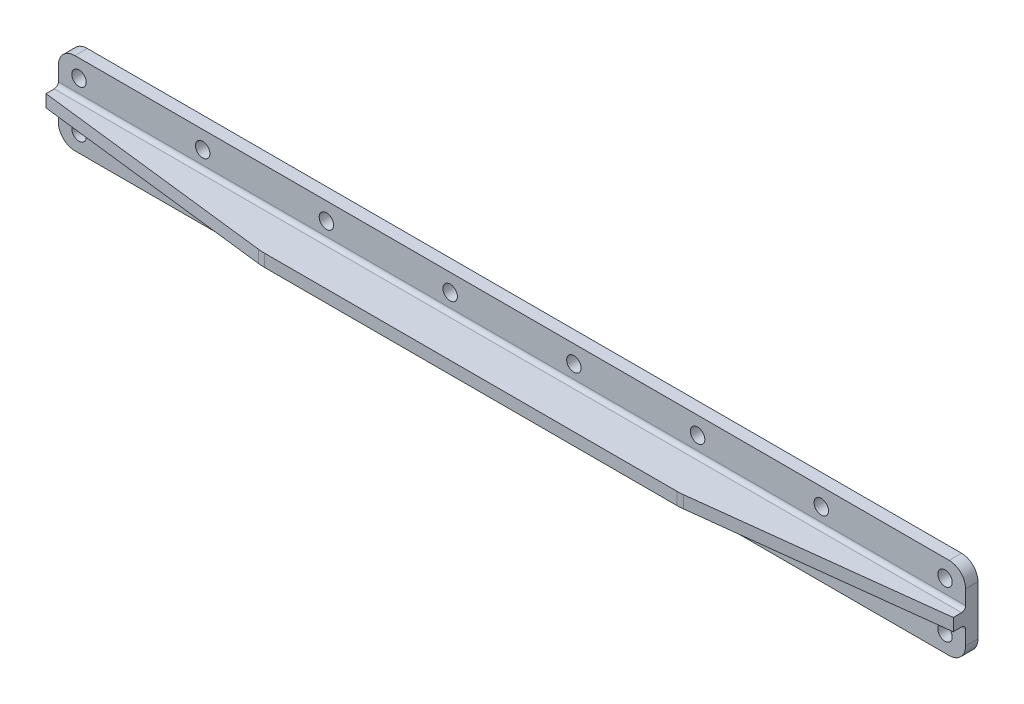
ISO-10303-21;
HEADER;
FILE_DESCRIPTION(('STEP AP214'),'2;1');
FILE_NAME('part.step','',(''),(''),'','','');
FILE_SCHEMA(('AUTOMOTIVE_DESIGN { 1 0 10303 214 1 1 1 1 }'));
ENDSEC;
DATA;
#1=APPLICATION_CONTEXT('core data for automotive mechanical design processes');
#2=APPLICATION_PROTOCOL_DEFINITION('international standard','automotive_design',2000,#1);
#3=PRODUCT_CONTEXT('',#1,'mechanical');
#4=PRODUCT('Part','Part','',(#3));
#5=PRODUCT_RELATED_PRODUCT_CATEGORY('part','',(#4));
#6=PRODUCT_DEFINITION_FORMATION('','',#4);
#7=PRODUCT_DEFINITION_CONTEXT('part definition',#1,'design');
#8=PRODUCT_DEFINITION('design','',#6,#7);
#9=PRODUCT_DEFINITION_SHAPE('','',#8);
#10=(LENGTH_UNIT() NAMED_UNIT(*) SI_UNIT(.MILLI.,.METRE.));
#11=(NAMED_UNIT(*) PLANE_ANGLE_UNIT() SI_UNIT($,.RADIAN.));
#12=(NAMED_UNIT(*) SI_UNIT($,.STERADIAN.) SOLID_ANGLE_UNIT());
#13=UNCERTAINTY_MEASURE_WITH_UNIT(LENGTH_MEASURE(1.E-05),#10,'distance_accuracy_value','');
#14=(GEOMETRIC_REPRESENTATION_CONTEXT(3) GLOBAL_UNCERTAINTY_ASSIGNED_CONTEXT((#13)) GLOBAL_UNIT_ASSIGNED_CONTEXT((#10,
#11,#12)) REPRESENTATION_CONTEXT('',''));
#15=CARTESIAN_POINT('',(0.,0.,0.));
#16=DIRECTION('',(0.,0.,1.));
#17=DIRECTION('',(1.,0.,0.));
#18=AXIS2_PLACEMENT_3D('',#15,#16,#17);
#19=CARTESIAN_POINT('',(110.,-1.5,13.));
#20=DIRECTION('',(0.,0.,-1.));
#21=DIRECTION('',(-1.,0.,0.));
#22=AXIS2_PLACEMENT_3D('',#19,#20,#21);
#23=PLANE('',#22);
#24=DIRECTION('',(0.,1.,0.));
#25=VECTOR('',#24,1.);
#26=CARTESIAN_POINT('',(50.,-10.,13.));
#27=LINE('',#26,#25);
#28=CARTESIAN_POINT('',(50.,-1.5,13.));
#29=VERTEX_POINT('',#28);
#30=CARTESIAN_POINT('',(50.,1.5,13.));
#31=VERTEX_POINT('',#30);
#32=EDGE_CURVE('E191',#29,#31,#27,.T.);
#33=ORIENTED_EDGE('',*,*,#32,.T.);
#34=DIRECTION('',(-1.,0.,0.));
#35=VECTOR('',#34,1.);
#36=CARTESIAN_POINT('',(110.,1.5,13.));
#37=LINE('',#36,#35);
#38=CARTESIAN_POINT('',(-50.,1.5,13.));
#39=VERTEX_POINT('',#38);
#40=EDGE_CURVE('E341',#31,#39,#37,.T.);
#41=ORIENTED_EDGE('',*,*,#40,.T.);
#42=DIRECTION('',(0.,1.,0.));
#43=VECTOR('',#42,1.);
#44=CARTESIAN_POINT('',(-50.,-10.,13.));
#45=LINE('',#44,#43);
#46=CARTESIAN_POINT('',(-50.,-1.5,13.));
#47=VERTEX_POINT('',#46);
#48=EDGE_CURVE('E205',#47,#39,#45,.T.);
#49=ORIENTED_EDGE('',*,*,#48,.F.);
#50=DIRECTION('',(-1.,0.,0.));
#51=VECTOR('',#50,1.);
#52=CARTESIAN_POINT('',(110.,-1.5,13.));
#53=LINE('',#52,#51);
#54=EDGE_CURVE('E339',#29,#47,#53,.T.);
#55=ORIENTED_EDGE('',*,*,#54,.F.);
#56=EDGE_LOOP('',(#33,#41,#49,#55));
#57=FACE_BOUND('',#56,.T.);
#58=ADVANCED_FACE('F33',(#57),#23,.F.);
#59=CARTESIAN_POINT('',(110.,1.5,13.));
#60=DIRECTION('',(0.,-1.,0.));
#61=DIRECTION('',(0.,0.,-1.));
#62=AXIS2_PLACEMENT_3D('',#59,#60,#61);
#63=PLANE('',#62);
#64=DIRECTION('',(0.,0.,1.));
#65=VECTOR('',#64,1.);
#66=CARTESIAN_POINT('',(110.,1.5,13.));
#67=LINE('',#66,#65);
#68=CARTESIAN_POINT('',(110.,1.5,4.));
#69=VERTEX_POINT('',#68);
#70=CARTESIAN_POINT('',(110.,1.5,6.));
#71=VERTEX_POINT('',#70);
#72=EDGE_CURVE('E158',#69,#71,#67,.T.);
#73=ORIENTED_EDGE('',*,*,#72,.F.);
#74=DIRECTION('',(-1.,0.,0.));
#75=VECTOR('',#74,1.);
#76=CARTESIAN_POINT('',(-110.,1.5,4.));
#77=LINE('',#76,#75);
#78=CARTESIAN_POINT('',(-110.,1.5,4.));
#79=VERTEX_POINT('',#78);
#80=EDGE_CURVE('E389',#69,#79,#77,.T.);
#81=ORIENTED_EDGE('',*,*,#80,.T.);
#82=DIRECTION('',(0.,0.,1.));
#83=VECTOR('',#82,1.);
#84=CARTESIAN_POINT('',(-110.,1.5,13.));
#85=LINE('',#84,#83);
#86=CARTESIAN_POINT('',(-110.,1.5,6.));
#87=VERTEX_POINT('',#86);
#88=EDGE_CURVE('E319',#79,#87,#85,.T.);
#89=ORIENTED_EDGE('',*,*,#88,.T.);
#90=DIRECTION('',(-0.993089709571982,0.,-0.117357695709469));
#91=VECTOR('',#90,1.);
#92=CARTESIAN_POINT('',(-51.5256500442231,1.5,12.9101662244358));
#93=LINE('',#92,#91);
#94=CARTESIAN_POINT('',(-51.5256500442231,1.5,12.9101662244358));
#95=VERTEX_POINT('',#94);
#96=EDGE_CURVE('E202',#95,#87,#93,.T.);
#97=ORIENTED_EDGE('',*,*,#96,.F.);
#98=CARTESIAN_POINT('',(-50.,1.5,0.));
#99=DIRECTION('',(0.,-1.,0.));
#100=DIRECTION('',(0.,0.,1.));
#101=AXIS2_PLACEMENT_3D('',#98,#99,#100);
#102=CIRCLE('',#101,13.);
#103=EDGE_CURVE('E199',#39,#95,#102,.T.);
#104=ORIENTED_EDGE('',*,*,#103,.F.);
#105=ORIENTED_EDGE('',*,*,#40,.F.);
#106=CARTESIAN_POINT('',(50.,1.5,0.));
#107=DIRECTION('',(0.,-1.,0.));
#108=DIRECTION('',(0.,0.,1.));
#109=AXIS2_PLACEMENT_3D('',#106,#107,#108);
#110=CIRCLE('',#109,13.);
#111=CARTESIAN_POINT('',(51.5256500442231,1.5,12.9101662244358));
#112=VERTEX_POINT('',#111);
#113=EDGE_CURVE('E186',#112,#31,#110,.T.);
#114=ORIENTED_EDGE('',*,*,#113,.F.);
#115=DIRECTION('',(-0.993089709571982,0.,0.117357695709469));
#116=VECTOR('',#115,1.);
#117=CARTESIAN_POINT('',(51.5256500442231,1.5,12.9101662244358));
#118=LINE('',#117,#116);
#119=EDGE_CURVE('E177',#71,#112,#118,.T.);
#120=ORIENTED_EDGE('',*,*,#119,.F.);
#121=EDGE_LOOP('',(#73,#81,#89,#97,#104,#105,#114,#120));
#122=FACE_BOUND('',#121,.T.);
#123=ADVANCED_FACE('F184',(#122),#63,.F.);
#124=CARTESIAN_POINT('',(110.,-1.5,13.));
#125=DIRECTION('',(0.,1.,0.));
#126=DIRECTION('',(0.,0.,1.));
#127=AXIS2_PLACEMENT_3D('',#124,#125,#126);
#128=PLANE('',#127);
#129=DIRECTION('',(0.,0.,-1.));
#130=VECTOR('',#129,1.);
#131=CARTESIAN_POINT('',(-110.,-1.5,13.));
#132=LINE('',#131,#130);
#133=CARTESIAN_POINT('',(-110.,-1.5,6.));
#134=VERTEX_POINT('',#133);
#135=CARTESIAN_POINT('',(-110.,-1.5,4.));
#136=VERTEX_POINT('',#135);
#137=EDGE_CURVE('E321',#134,#136,#132,.T.);
#138=ORIENTED_EDGE('',*,*,#137,.T.);
#139=DIRECTION('',(-1.,0.,0.));
#140=VECTOR('',#139,1.);
#141=CARTESIAN_POINT('',(110.,-1.5,4.));
#142=LINE('',#141,#140);
#143=CARTESIAN_POINT('',(110.,-1.5,4.));
#144=VERTEX_POINT('',#143);
#145=EDGE_CURVE('E387',#136,#144,#142,.F.);
#146=ORIENTED_EDGE('',*,*,#145,.T.);
#147=DIRECTION('',(0.,0.,-1.));
#148=VECTOR('',#147,1.);
#149=CARTESIAN_POINT('',(110.,-1.5,13.));
#150=LINE('',#149,#148);
#151=CARTESIAN_POINT('',(110.,-1.5,6.));
#152=VERTEX_POINT('',#151);
#153=EDGE_CURVE('E170',#152,#144,#150,.T.);
#154=ORIENTED_EDGE('',*,*,#153,.F.);
#155=DIRECTION('',(-0.993089709571982,0.,0.117357695709469));
#156=VECTOR('',#155,1.);
#157=CARTESIAN_POINT('',(109.184172960363,-1.5,6.09640980119566));
#158=LINE('',#157,#156);
#159=CARTESIAN_POINT('',(51.5256500442231,-1.5,12.9101662244358));
#160=VERTEX_POINT('',#159);
#161=EDGE_CURVE('E180',#152,#160,#158,.T.);
#162=ORIENTED_EDGE('',*,*,#161,.T.);
#163=CARTESIAN_POINT('',(50.,-1.5,0.));
#164=DIRECTION('',(0.,1.,0.));
#165=DIRECTION('',(0.,0.,1.));
#166=AXIS2_PLACEMENT_3D('',#163,#164,#165);
#167=CIRCLE('',#166,13.);
#168=EDGE_CURVE('E196',#160,#29,#167,.F.);
#169=ORIENTED_EDGE('',*,*,#168,.T.);
#170=ORIENTED_EDGE('',*,*,#54,.T.);
#171=CARTESIAN_POINT('',(-50.,-1.5,0.));
#172=DIRECTION('',(0.,1.,0.));
#173=DIRECTION('',(0.,0.,1.));
#174=AXIS2_PLACEMENT_3D('',#171,#172,#173);
#175=CIRCLE('',#174,13.);
#176=CARTESIAN_POINT('',(-51.5256500442231,-1.5,12.9101662244358));
#177=VERTEX_POINT('',#176);
#178=EDGE_CURVE('E182',#47,#177,#175,.F.);
#179=ORIENTED_EDGE('',*,*,#178,.T.);
#180=DIRECTION('',(-0.993089709571982,0.,-0.117357695709469));
#181=VECTOR('',#180,1.);
#182=CARTESIAN_POINT('',(107.785804716345,-1.5,31.7366881897894));
#183=LINE('',#182,#181);
#184=EDGE_CURVE('E208',#177,#134,#183,.T.);
#185=ORIENTED_EDGE('',*,*,#184,.T.);
#186=EDGE_LOOP('',(#138,#146,#154,#162,#169,#170,#179,#185));
#187=FACE_BOUND('',#186,.T.);
#188=ADVANCED_FACE('F412',(#187),#128,.F.);
#189=CARTESIAN_POINT('',(110.,1.5,3.));
#190=DIRECTION('',(0.,0.,-1.));
#191=DIRECTION('',(0.,1.,0.));
#192=AXIS2_PLACEMENT_3D('',#189,#190,#191);
#193=PLANE('',#192);
#194=CARTESIAN_POINT('',(15.,5.74999999999999,3.));
#195=DIRECTION('',(0.,0.,1.));
#196=DIRECTION('',(1.,0.,0.));
#197=AXIS2_PLACEMENT_3D('',#194,#195,#196);
#198=CIRCLE('',#197,1.75);
#199=CARTESIAN_POINT('',(16.75,5.74999999999999,3.));
#200=VERTEX_POINT('',#199);
#201=EDGE_CURVE('E260',#200,#200,#198,.T.);
#202=ORIENTED_EDGE('',*,*,#201,.F.);
#203=EDGE_LOOP('',(#202));
#204=FACE_BOUND('',#203,.T.);
#205=CARTESIAN_POINT('',(45.,5.74999999999999,3.));
#206=DIRECTION('',(0.,0.,1.));
#207=DIRECTION('',(1.,0.,0.));
#208=AXIS2_PLACEMENT_3D('',#205,#206,#207);
#209=CIRCLE('',#208,1.75);
#210=CARTESIAN_POINT('',(46.75,5.74999999999999,3.));
#211=VERTEX_POINT('',#210);
#212=EDGE_CURVE('E266',#211,#211,#209,.T.);
#213=ORIENTED_EDGE('',*,*,#212,.F.);
#214=EDGE_LOOP('',(#213));
#215=FACE_BOUND('',#214,.T.);
#216=CARTESIAN_POINT('',(75.,5.74999999999999,3.));
#217=DIRECTION('',(0.,0.,1.));
#218=DIRECTION('',(1.,0.,0.));
#219=AXIS2_PLACEMENT_3D('',#216,#217,#218);
#220=CIRCLE('',#219,1.75);
#221=CARTESIAN_POINT('',(76.75,5.74999999999999,3.));
#222=VERTEX_POINT('',#221);
#223=EDGE_CURVE('E272',#222,#222,#220,.T.);
#224=ORIENTED_EDGE('',*,*,#223,.F.);
#225=EDGE_LOOP('',(#224));
#226=FACE_BOUND('',#225,.T.);
#227=CARTESIAN_POINT('',(105.,5.75,3.));
#228=DIRECTION('',(0.,0.,1.));
#229=DIRECTION('',(1.,0.,0.));
#230=AXIS2_PLACEMENT_3D('',#227,#228,#229);
#231=CIRCLE('',#230,1.75);
#232=CARTESIAN_POINT('',(106.75,5.75,3.));
#233=VERTEX_POINT('',#232);
#234=EDGE_CURVE('E278',#233,#233,#231,.T.);
#235=ORIENTED_EDGE('',*,*,#234,.F.);
#236=EDGE_LOOP('',(#235));
#237=FACE_BOUND('',#236,.T.);
#238=CARTESIAN_POINT('',(-105.,5.75,3.));
#239=DIRECTION('',(0.,0.,1.));
#240=DIRECTION('',(-1.,0.,0.));
#241=AXIS2_PLACEMENT_3D('',#238,#239,#240);
#242=CIRCLE('',#241,1.75);
#243=CARTESIAN_POINT('',(-106.75,5.75,3.));
#244=VERTEX_POINT('',#243);
#245=EDGE_CURVE('E284',#244,#244,#242,.T.);
#246=ORIENTED_EDGE('',*,*,#245,.F.);
#247=EDGE_LOOP('',(#246));
#248=FACE_BOUND('',#247,.T.);
#249=CARTESIAN_POINT('',(-75.,5.74999999999999,3.));
#250=DIRECTION('',(0.,0.,1.));
#251=DIRECTION('',(-1.,0.,0.));
#252=AXIS2_PLACEMENT_3D('',#249,#250,#251);
#253=CIRCLE('',#252,1.75);
#254=CARTESIAN_POINT('',(-76.75,5.74999999999999,3.));
#255=VERTEX_POINT('',#254);
#256=EDGE_CURVE('E290',#255,#255,#253,.T.);
#257=ORIENTED_EDGE('',*,*,#256,.F.);
#258=EDGE_LOOP('',(#257));
#259=FACE_BOUND('',#258,.T.);
#260=CARTESIAN_POINT('',(-45.,5.74999999999999,3.));
#261=DIRECTION('',(0.,0.,1.));
#262=DIRECTION('',(-1.,0.,0.));
#263=AXIS2_PLACEMENT_3D('',#260,#261,#262);
#264=CIRCLE('',#263,1.75);
#265=CARTESIAN_POINT('',(-46.75,5.74999999999999,3.));
#266=VERTEX_POINT('',#265);
#267=EDGE_CURVE('E296',#266,#266,#264,.T.);
#268=ORIENTED_EDGE('',*,*,#267,.F.);
#269=EDGE_LOOP('',(#268));
#270=FACE_BOUND('',#269,.T.);
#271=CARTESIAN_POINT('',(-15.,5.74999999999999,3.));
#272=DIRECTION('',(0.,0.,1.));
#273=DIRECTION('',(-1.,0.,0.));
#274=AXIS2_PLACEMENT_3D('',#271,#272,#273);
#275=CIRCLE('',#274,1.75);
#276=CARTESIAN_POINT('',(-16.75,5.74999999999999,3.));
#277=VERTEX_POINT('',#276);
#278=EDGE_CURVE('E213',#277,#277,#275,.T.);
#279=ORIENTED_EDGE('',*,*,#278,.F.);
#280=EDGE_LOOP('',(#279));
#281=FACE_BOUND('',#280,.T.);
#282=DIRECTION('',(0.,-1.,0.));
#283=VECTOR('',#282,1.);
#284=CARTESIAN_POINT('',(-110.,1.5,3.));
#285=LINE('',#284,#283);
#286=CARTESIAN_POINT('',(-110.,6.,3.));
#287=VERTEX_POINT('',#286);
#288=CARTESIAN_POINT('',(-110.,2.5,3.));
#289=VERTEX_POINT('',#288);
#290=EDGE_CURVE('E307',#287,#289,#285,.T.);
#291=ORIENTED_EDGE('',*,*,#290,.T.);
#292=DIRECTION('',(-1.,0.,0.));
#293=VECTOR('',#292,1.);
#294=CARTESIAN_POINT('',(110.,2.5,3.));
#295=LINE('',#294,#293);
#296=CARTESIAN_POINT('',(110.,2.5,3.));
#297=VERTEX_POINT('',#296);
#298=EDGE_CURVE('E54',#289,#297,#295,.F.);
#299=ORIENTED_EDGE('',*,*,#298,.T.);
#300=DIRECTION('',(0.,-1.,0.));
#301=VECTOR('',#300,1.);
#302=CARTESIAN_POINT('',(110.,1.5,3.));
#303=LINE('',#302,#301);
#304=CARTESIAN_POINT('',(110.,6.,3.));
#305=VERTEX_POINT('',#304);
#306=EDGE_CURVE('E171',#305,#297,#303,.T.);
#307=ORIENTED_EDGE('',*,*,#306,.F.);
#308=CARTESIAN_POINT('',(106.,6.,3.));
#309=DIRECTION('',(0.,0.,-1.));
#310=DIRECTION('',(0.,1.,0.));
#311=AXIS2_PLACEMENT_3D('',#308,#309,#310);
#312=CIRCLE('',#311,4.);
#313=CARTESIAN_POINT('',(106.,10.,3.));
#314=VERTEX_POINT('',#313);
#315=EDGE_CURVE('E354',#305,#314,#312,.F.);
#316=ORIENTED_EDGE('',*,*,#315,.T.);
#317=DIRECTION('',(-1.,0.,0.));
#318=VECTOR('',#317,1.);
#319=CARTESIAN_POINT('',(110.,10.,3.));
#320=LINE('',#319,#318);
#321=CARTESIAN_POINT('',(-106.,10.,3.));
#322=VERTEX_POINT('',#321);
#323=EDGE_CURVE('E317',#314,#322,#320,.T.);
#324=ORIENTED_EDGE('',*,*,#323,.T.);
#325=CARTESIAN_POINT('',(-106.,6.,3.));
#326=DIRECTION('',(0.,0.,-1.));
#327=DIRECTION('',(0.,1.,0.));
#328=AXIS2_PLACEMENT_3D('',#325,#326,#327);
#329=CIRCLE('',#328,4.);
#330=EDGE_CURVE('E352',#322,#287,#329,.F.);
#331=ORIENTED_EDGE('',*,*,#330,.T.);
#332=EDGE_LOOP('',(#291,#299,#307,#316,#324,#331));
#333=FACE_BOUND('',#332,.T.);
#334=ADVANCED_FACE('F438',(#204,#215,#226,#237,#248,#259,#270,#281,#333),#193,.F.);
#335=CARTESIAN_POINT('',(110.,-1.5,3.));
#336=DIRECTION('',(0.,0.,-1.));
#337=DIRECTION('',(0.,1.,0.));
#338=AXIS2_PLACEMENT_3D('',#335,#336,#337);
#339=PLANE('',#338);
#340=CARTESIAN_POINT('',(-45.,-5.74999999999999,3.));
#341=DIRECTION('',(0.,0.,1.));
#342=DIRECTION('',(1.,0.,0.));
#343=AXIS2_PLACEMENT_3D('',#340,#341,#342);
#344=CIRCLE('',#343,1.75);
#345=CARTESIAN_POINT('',(-43.25,-5.74999999999999,3.));
#346=VERTEX_POINT('',#345);
#347=EDGE_CURVE('E218',#346,#346,#344,.T.);
#348=ORIENTED_EDGE('',*,*,#347,.F.);
#349=EDGE_LOOP('',(#348));
#350=FACE_BOUND('',#349,.T.);
#351=CARTESIAN_POINT('',(-75.,-5.75,3.));
#352=DIRECTION('',(0.,0.,1.));
#353=DIRECTION('',(1.,0.,0.));
#354=AXIS2_PLACEMENT_3D('',#351,#352,#353);
#355=CIRCLE('',#354,1.75);
#356=CARTESIAN_POINT('',(-73.25,-5.75,3.));
#357=VERTEX_POINT('',#356);
#358=EDGE_CURVE('E224',#357,#357,#355,.T.);
#359=ORIENTED_EDGE('',*,*,#358,.F.);
#360=EDGE_LOOP('',(#359));
#361=FACE_BOUND('',#360,.T.);
#362=CARTESIAN_POINT('',(-105.,-5.75,3.));
#363=DIRECTION('',(0.,0.,1.));
#364=DIRECTION('',(1.,0.,0.));
#365=AXIS2_PLACEMENT_3D('',#362,#363,#364);
#366=CIRCLE('',#365,1.75);
#367=CARTESIAN_POINT('',(-103.25,-5.75,3.));
#368=VERTEX_POINT('',#367);
#369=EDGE_CURVE('E230',#368,#368,#366,.T.);
#370=ORIENTED_EDGE('',*,*,#369,.F.);
#371=EDGE_LOOP('',(#370));
#372=FACE_BOUND('',#371,.T.);
#373=CARTESIAN_POINT('',(105.,-5.75,3.));
#374=DIRECTION('',(0.,0.,1.));
#375=DIRECTION('',(-1.,0.,0.));
#376=AXIS2_PLACEMENT_3D('',#373,#374,#375);
#377=CIRCLE('',#376,1.75);
#378=CARTESIAN_POINT('',(103.25,-5.75,3.));
#379=VERTEX_POINT('',#378);
#380=EDGE_CURVE('E236',#379,#379,#377,.T.);
#381=ORIENTED_EDGE('',*,*,#380,.F.);
#382=EDGE_LOOP('',(#381));
#383=FACE_BOUND('',#382,.T.);
#384=CARTESIAN_POINT('',(75.,-5.75,3.));
#385=DIRECTION('',(0.,0.,1.));
#386=DIRECTION('',(-1.,0.,0.));
#387=AXIS2_PLACEMENT_3D('',#384,#385,#386);
#388=CIRCLE('',#387,1.75);
#389=CARTESIAN_POINT('',(73.25,-5.75,3.));
#390=VERTEX_POINT('',#389);
#391=EDGE_CURVE('E242',#390,#390,#388,.T.);
#392=ORIENTED_EDGE('',*,*,#391,.F.);
#393=EDGE_LOOP('',(#392));
#394=FACE_BOUND('',#393,.T.);
#395=CARTESIAN_POINT('',(45.,-5.74999999999999,3.));
#396=DIRECTION('',(0.,0.,1.));
#397=DIRECTION('',(-1.,0.,0.));
#398=AXIS2_PLACEMENT_3D('',#395,#396,#397);
#399=CIRCLE('',#398,1.75);
#400=CARTESIAN_POINT('',(43.25,-5.74999999999999,3.));
#401=VERTEX_POINT('',#400);
#402=EDGE_CURVE('E248',#401,#401,#399,.T.);
#403=ORIENTED_EDGE('',*,*,#402,.F.);
#404=EDGE_LOOP('',(#403));
#405=FACE_BOUND('',#404,.T.);
#406=CARTESIAN_POINT('',(15.,-5.74999999999999,3.));
#407=DIRECTION('',(0.,0.,1.));
#408=DIRECTION('',(-1.,0.,0.));
#409=AXIS2_PLACEMENT_3D('',#406,#407,#408);
#410=CIRCLE('',#409,1.75);
#411=CARTESIAN_POINT('',(13.25,-5.74999999999999,3.));
#412=VERTEX_POINT('',#411);
#413=EDGE_CURVE('E254',#412,#412,#410,.T.);
#414=ORIENTED_EDGE('',*,*,#413,.F.);
#415=EDGE_LOOP('',(#414));
#416=FACE_BOUND('',#415,.T.);
#417=CARTESIAN_POINT('',(-15.,-5.74999999999999,3.));
#418=DIRECTION('',(0.,0.,1.));
#419=DIRECTION('',(1.,0.,0.));
#420=AXIS2_PLACEMENT_3D('',#417,#418,#419);
#421=CIRCLE('',#420,1.75);
#422=CARTESIAN_POINT('',(-13.25,-5.74999999999999,3.));
#423=VERTEX_POINT('',#422);
#424=EDGE_CURVE('E217',#423,#423,#421,.T.);
#425=ORIENTED_EDGE('',*,*,#424,.F.);
#426=EDGE_LOOP('',(#425));
#427=FACE_BOUND('',#426,.T.);
#428=DIRECTION('',(0.,-1.,0.));
#429=VECTOR('',#428,1.);
#430=CARTESIAN_POINT('',(110.,-1.5,3.));
#431=LINE('',#430,#429);
#432=CARTESIAN_POINT('',(110.,-2.5,3.));
#433=VERTEX_POINT('',#432);
#434=CARTESIAN_POINT('',(110.,-6.,3.));
#435=VERTEX_POINT('',#434);
#436=EDGE_CURVE('E313',#433,#435,#431,.T.);
#437=ORIENTED_EDGE('',*,*,#436,.F.);
#438=DIRECTION('',(-1.,0.,0.));
#439=VECTOR('',#438,1.);
#440=CARTESIAN_POINT('',(-110.,-2.5,3.));
#441=LINE('',#440,#439);
#442=CARTESIAN_POINT('',(-110.,-2.5,3.));
#443=VERTEX_POINT('',#442);
#444=EDGE_CURVE('E384',#433,#443,#441,.T.);
#445=ORIENTED_EDGE('',*,*,#444,.T.);
#446=DIRECTION('',(0.,-1.,0.));
#447=VECTOR('',#446,1.);
#448=CARTESIAN_POINT('',(-110.,-1.5,3.));
#449=LINE('',#448,#447);
#450=CARTESIAN_POINT('',(-110.,-6.,3.));
#451=VERTEX_POINT('',#450);
#452=EDGE_CURVE('E324',#443,#451,#449,.T.);
#453=ORIENTED_EDGE('',*,*,#452,.T.);
#454=CARTESIAN_POINT('',(-106.,-6.,3.));
#455=DIRECTION('',(0.,0.,-1.));
#456=DIRECTION('',(0.,1.,0.));
#457=AXIS2_PLACEMENT_3D('',#454,#455,#456);
#458=CIRCLE('',#457,4.);
#459=CARTESIAN_POINT('',(-106.,-10.,3.));
#460=VERTEX_POINT('',#459);
#461=EDGE_CURVE('E374',#451,#460,#458,.F.);
#462=ORIENTED_EDGE('',*,*,#461,.T.);
#463=DIRECTION('',(-1.,0.,0.));
#464=VECTOR('',#463,1.);
#465=CARTESIAN_POINT('',(110.,-10.,3.));
#466=LINE('',#465,#464);
#467=CARTESIAN_POINT('',(106.,-10.,3.));
#468=VERTEX_POINT('',#467);
#469=EDGE_CURVE('E336',#468,#460,#466,.T.);
#470=ORIENTED_EDGE('',*,*,#469,.F.);
#471=CARTESIAN_POINT('',(106.,-6.,3.));
#472=DIRECTION('',(0.,0.,-1.));
#473=DIRECTION('',(0.,1.,0.));
#474=AXIS2_PLACEMENT_3D('',#471,#472,#473);
#475=CIRCLE('',#474,4.);
#476=EDGE_CURVE('E376',#468,#435,#475,.F.);
#477=ORIENTED_EDGE('',*,*,#476,.T.);
#478=EDGE_LOOP('',(#437,#445,#453,#462,#470,#477));
#479=FACE_BOUND('',#478,.T.);
#480=ADVANCED_FACE('F401',(#350,#361,#372,#383,#394,#405,#416,#427,#479),#339,.F.);
#481=CARTESIAN_POINT('',(110.,-10.,3.));
#482=DIRECTION('',(0.,1.,0.));
#483=DIRECTION('',(0.,0.,1.));
#484=AXIS2_PLACEMENT_3D('',#481,#482,#483);
#485=PLANE('',#484);
#486=DIRECTION('',(-1.,0.,0.));
#487=VECTOR('',#486,1.);
#488=CARTESIAN_POINT('',(110.,-10.,0.));
#489=LINE('',#488,#487);
#490=CARTESIAN_POINT('',(106.,-10.,0.));
#491=VERTEX_POINT('',#490);
#492=CARTESIAN_POINT('',(-106.,-10.,0.));
#493=VERTEX_POINT('',#492);
#494=EDGE_CURVE('E333',#491,#493,#489,.T.);
#495=ORIENTED_EDGE('',*,*,#494,.F.);
#496=DIRECTION('',(0.,0.,-1.));
#497=VECTOR('',#496,1.);
#498=CARTESIAN_POINT('',(106.,-10.,3.));
#499=LINE('',#498,#497);
#500=EDGE_CURVE('E372',#491,#468,#499,.F.);
#501=ORIENTED_EDGE('',*,*,#500,.T.);
#502=ORIENTED_EDGE('',*,*,#469,.T.);
#503=DIRECTION('',(0.,0.,-1.));
#504=VECTOR('',#503,1.);
#505=CARTESIAN_POINT('',(-106.,-10.,0.));
#506=LINE('',#505,#504);
#507=EDGE_CURVE('E369',#460,#493,#506,.T.);
#508=ORIENTED_EDGE('',*,*,#507,.T.);
#509=EDGE_LOOP('',(#495,#501,#502,#508));
#510=FACE_BOUND('',#509,.T.);
#511=ADVANCED_FACE('F474',(#510),#485,.F.);
#512=CARTESIAN_POINT('',(110.,10.,0.));
#513=DIRECTION('',(0.,0.,1.));
#514=DIRECTION('',(1.,0.,0.));
#515=AXIS2_PLACEMENT_3D('',#512,#513,#514);
#516=PLANE('',#515);
#517=CARTESIAN_POINT('',(-45.,-5.74999999999999,0.));
#518=DIRECTION('',(0.,0.,1.));
#519=DIRECTION('',(1.,0.,0.));
#520=AXIS2_PLACEMENT_3D('',#517,#518,#519);
#521=CIRCLE('',#520,1.75);
#522=CARTESIAN_POINT('',(-43.25,-5.74999999999999,0.));
#523=VERTEX_POINT('',#522);
#524=EDGE_CURVE('E214',#523,#523,#521,.T.);
#525=ORIENTED_EDGE('',*,*,#524,.T.);
#526=EDGE_LOOP('',(#525));
#527=FACE_BOUND('',#526,.T.);
#528=CARTESIAN_POINT('',(-75.,-5.75,0.));
#529=DIRECTION('',(0.,0.,1.));
#530=DIRECTION('',(1.,0.,0.));
#531=AXIS2_PLACEMENT_3D('',#528,#529,#530);
#532=CIRCLE('',#531,1.75);
#533=CARTESIAN_POINT('',(-73.25,-5.75,0.));
#534=VERTEX_POINT('',#533);
#535=EDGE_CURVE('E221',#534,#534,#532,.T.);
#536=ORIENTED_EDGE('',*,*,#535,.T.);
#537=EDGE_LOOP('',(#536));
#538=FACE_BOUND('',#537,.T.);
#539=CARTESIAN_POINT('',(-105.,-5.75,0.));
#540=DIRECTION('',(0.,0.,1.));
#541=DIRECTION('',(1.,0.,0.));
#542=AXIS2_PLACEMENT_3D('',#539,#540,#541);
#543=CIRCLE('',#542,1.75);
#544=CARTESIAN_POINT('',(-103.25,-5.75,0.));
#545=VERTEX_POINT('',#544);
#546=EDGE_CURVE('E227',#545,#545,#543,.T.);
#547=ORIENTED_EDGE('',*,*,#546,.T.);
#548=EDGE_LOOP('',(#547));
#549=FACE_BOUND('',#548,.T.);
#550=CARTESIAN_POINT('',(105.,-5.75,0.));
#551=DIRECTION('',(0.,0.,1.));
#552=DIRECTION('',(-1.,0.,0.));
#553=AXIS2_PLACEMENT_3D('',#550,#551,#552);
#554=CIRCLE('',#553,1.75);
#555=CARTESIAN_POINT('',(103.25,-5.75,0.));
#556=VERTEX_POINT('',#555);
#557=EDGE_CURVE('E233',#556,#556,#554,.T.);
#558=ORIENTED_EDGE('',*,*,#557,.T.);
#559=EDGE_LOOP('',(#558));
#560=FACE_BOUND('',#559,.T.);
#561=CARTESIAN_POINT('',(75.,-5.75,0.));
#562=DIRECTION('',(0.,0.,1.));
#563=DIRECTION('',(-1.,0.,0.));
#564=AXIS2_PLACEMENT_3D('',#561,#562,#563);
#565=CIRCLE('',#564,1.75);
#566=CARTESIAN_POINT('',(73.25,-5.75,0.));
#567=VERTEX_POINT('',#566);
#568=EDGE_CURVE('E239',#567,#567,#565,.T.);
#569=ORIENTED_EDGE('',*,*,#568,.T.);
#570=EDGE_LOOP('',(#569));
#571=FACE_BOUND('',#570,.T.);
#572=CARTESIAN_POINT('',(45.,-5.74999999999999,0.));
#573=DIRECTION('',(0.,0.,1.));
#574=DIRECTION('',(-1.,0.,0.));
#575=AXIS2_PLACEMENT_3D('',#572,#573,#574);
#576=CIRCLE('',#575,1.75);
#577=CARTESIAN_POINT('',(43.25,-5.74999999999999,0.));
#578=VERTEX_POINT('',#577);
#579=EDGE_CURVE('E245',#578,#578,#576,.T.);
#580=ORIENTED_EDGE('',*,*,#579,.T.);
#581=EDGE_LOOP('',(#580));
#582=FACE_BOUND('',#581,.T.);
#583=CARTESIAN_POINT('',(15.,-5.74999999999999,0.));
#584=DIRECTION('',(0.,0.,1.));
#585=DIRECTION('',(-1.,0.,0.));
#586=AXIS2_PLACEMENT_3D('',#583,#584,#585);
#587=CIRCLE('',#586,1.75);
#588=CARTESIAN_POINT('',(13.25,-5.74999999999999,0.));
#589=VERTEX_POINT('',#588);
#590=EDGE_CURVE('E251',#589,#589,#587,.T.);
#591=ORIENTED_EDGE('',*,*,#590,.T.);
#592=EDGE_LOOP('',(#591));
#593=FACE_BOUND('',#592,.T.);
#594=CARTESIAN_POINT('',(15.,5.74999999999999,0.));
#595=DIRECTION('',(0.,0.,1.));
#596=DIRECTION('',(1.,0.,0.));
#597=AXIS2_PLACEMENT_3D('',#594,#595,#596);
#598=CIRCLE('',#597,1.75);
#599=CARTESIAN_POINT('',(16.75,5.74999999999999,0.));
#600=VERTEX_POINT('',#599);
#601=EDGE_CURVE('E257',#600,#600,#598,.T.);
#602=ORIENTED_EDGE('',*,*,#601,.T.);
#603=EDGE_LOOP('',(#602));
#604=FACE_BOUND('',#603,.T.);
#605=CARTESIAN_POINT('',(45.,5.74999999999999,0.));
#606=DIRECTION('',(0.,0.,1.));
#607=DIRECTION('',(1.,0.,0.));
#608=AXIS2_PLACEMENT_3D('',#605,#606,#607);
#609=CIRCLE('',#608,1.75);
#610=CARTESIAN_POINT('',(46.75,5.74999999999999,0.));
#611=VERTEX_POINT('',#610);
#612=EDGE_CURVE('E263',#611,#611,#609,.T.);
#613=ORIENTED_EDGE('',*,*,#612,.T.);
#614=EDGE_LOOP('',(#613));
#615=FACE_BOUND('',#614,.T.);
#616=CARTESIAN_POINT('',(75.,5.74999999999999,0.));
#617=DIRECTION('',(0.,0.,1.));
#618=DIRECTION('',(1.,0.,0.));
#619=AXIS2_PLACEMENT_3D('',#616,#617,#618);
#620=CIRCLE('',#619,1.75);
#621=CARTESIAN_POINT('',(76.75,5.74999999999999,0.));
#622=VERTEX_POINT('',#621);
#623=EDGE_CURVE('E269',#622,#622,#620,.T.);
#624=ORIENTED_EDGE('',*,*,#623,.T.);
#625=EDGE_LOOP('',(#624));
#626=FACE_BOUND('',#625,.T.);
#627=CARTESIAN_POINT('',(105.,5.75,0.));
#628=DIRECTION('',(0.,0.,1.));
#629=DIRECTION('',(1.,0.,0.));
#630=AXIS2_PLACEMENT_3D('',#627,#628,#629);
#631=CIRCLE('',#630,1.75);
#632=CARTESIAN_POINT('',(106.75,5.75,0.));
#633=VERTEX_POINT('',#632);
#634=EDGE_CURVE('E275',#633,#633,#631,.T.);
#635=ORIENTED_EDGE('',*,*,#634,.T.);
#636=EDGE_LOOP('',(#635));
#637=FACE_BOUND('',#636,.T.);
#638=CARTESIAN_POINT('',(-105.,5.75,0.));
#639=DIRECTION('',(0.,0.,1.));
#640=DIRECTION('',(-1.,0.,0.));
#641=AXIS2_PLACEMENT_3D('',#638,#639,#640);
#642=CIRCLE('',#641,1.75);
#643=CARTESIAN_POINT('',(-106.75,5.75,0.));
#644=VERTEX_POINT('',#643);
#645=EDGE_CURVE('E281',#644,#644,#642,.T.);
#646=ORIENTED_EDGE('',*,*,#645,.T.);
#647=EDGE_LOOP('',(#646));
#648=FACE_BOUND('',#647,.T.);
#649=CARTESIAN_POINT('',(-75.,5.74999999999999,0.));
#650=DIRECTION('',(0.,0.,1.));
#651=DIRECTION('',(-1.,0.,0.));
#652=AXIS2_PLACEMENT_3D('',#649,#650,#651);
#653=CIRCLE('',#652,1.75);
#654=CARTESIAN_POINT('',(-76.75,5.74999999999999,0.));
#655=VERTEX_POINT('',#654);
#656=EDGE_CURVE('E287',#655,#655,#653,.T.);
#657=ORIENTED_EDGE('',*,*,#656,.T.);
#658=EDGE_LOOP('',(#657));
#659=FACE_BOUND('',#658,.T.);
#660=CARTESIAN_POINT('',(-45.,5.74999999999999,0.));
#661=DIRECTION('',(0.,0.,1.));
#662=DIRECTION('',(-1.,0.,0.));
#663=AXIS2_PLACEMENT_3D('',#660,#661,#662);
#664=CIRCLE('',#663,1.75);
#665=CARTESIAN_POINT('',(-46.75,5.74999999999999,0.));
#666=VERTEX_POINT('',#665);
#667=EDGE_CURVE('E293',#666,#666,#664,.T.);
#668=ORIENTED_EDGE('',*,*,#667,.T.);
#669=EDGE_LOOP('',(#668));
#670=FACE_BOUND('',#669,.T.);
#671=CARTESIAN_POINT('',(-15.,5.74999999999999,0.));
#672=DIRECTION('',(0.,0.,1.));
#673=DIRECTION('',(-1.,0.,0.));
#674=AXIS2_PLACEMENT_3D('',#671,#672,#673);
#675=CIRCLE('',#674,1.75);
#676=CARTESIAN_POINT('',(-16.75,5.74999999999999,0.));
#677=VERTEX_POINT('',#676);
#678=EDGE_CURVE('E299',#677,#677,#675,.T.);
#679=ORIENTED_EDGE('',*,*,#678,.T.);
#680=EDGE_LOOP('',(#679));
#681=FACE_BOUND('',#680,.T.);
#682=CARTESIAN_POINT('',(-15.,-5.74999999999999,0.));
#683=DIRECTION('',(0.,0.,1.));
#684=DIRECTION('',(1.,0.,0.));
#685=AXIS2_PLACEMENT_3D('',#682,#683,#684);
#686=CIRCLE('',#685,1.75);
#687=CARTESIAN_POINT('',(-13.25,-5.74999999999999,0.));
#688=VERTEX_POINT('',#687);
#689=EDGE_CURVE('E304',#688,#688,#686,.T.);
#690=ORIENTED_EDGE('',*,*,#689,.T.);
#691=EDGE_LOOP('',(#690));
#692=FACE_BOUND('',#691,.T.);
#693=DIRECTION('',(-1.,0.,0.));
#694=VECTOR('',#693,1.);
#695=CARTESIAN_POINT('',(110.,10.,0.));
#696=LINE('',#695,#694);
#697=CARTESIAN_POINT('',(106.,10.,0.));
#698=VERTEX_POINT('',#697);
#699=CARTESIAN_POINT('',(-106.,10.,0.));
#700=VERTEX_POINT('',#699);
#701=EDGE_CURVE('E330',#698,#700,#696,.T.);
#702=ORIENTED_EDGE('',*,*,#701,.F.);
#703=CARTESIAN_POINT('',(106.,6.,0.));
#704=DIRECTION('',(0.,0.,1.));
#705=DIRECTION('',(1.,0.,0.));
#706=AXIS2_PLACEMENT_3D('',#703,#704,#705);
#707=CIRCLE('',#706,4.);
#708=CARTESIAN_POINT('',(110.,6.,0.));
#709=VERTEX_POINT('',#708);
#710=EDGE_CURVE('E367',#698,#709,#707,.F.);
#711=ORIENTED_EDGE('',*,*,#710,.T.);
#712=DIRECTION('',(0.,1.,0.));
#713=VECTOR('',#712,1.);
#714=CARTESIAN_POINT('',(110.,10.,0.));
#715=LINE('',#714,#713);
#716=CARTESIAN_POINT('',(110.,-6.,0.));
#717=VERTEX_POINT('',#716);
#718=EDGE_CURVE('E315',#717,#709,#715,.T.);
#719=ORIENTED_EDGE('',*,*,#718,.F.);
#720=CARTESIAN_POINT('',(106.,-6.,0.));
#721=DIRECTION('',(0.,0.,1.));
#722=DIRECTION('',(1.,0.,0.));
#723=AXIS2_PLACEMENT_3D('',#720,#721,#722);
#724=CIRCLE('',#723,4.);
#725=EDGE_CURVE('E365',#717,#491,#724,.F.);
#726=ORIENTED_EDGE('',*,*,#725,.T.);
#727=ORIENTED_EDGE('',*,*,#494,.T.);
#728=CARTESIAN_POINT('',(-106.,-6.,0.));
#729=DIRECTION('',(0.,0.,1.));
#730=DIRECTION('',(1.,0.,0.));
#731=AXIS2_PLACEMENT_3D('',#728,#729,#730);
#732=CIRCLE('',#731,4.);
#733=CARTESIAN_POINT('',(-110.,-6.,0.));
#734=VERTEX_POINT('',#733);
#735=EDGE_CURVE('E363',#493,#734,#732,.F.);
#736=ORIENTED_EDGE('',*,*,#735,.T.);
#737=DIRECTION('',(0.,1.,0.));
#738=VECTOR('',#737,1.);
#739=CARTESIAN_POINT('',(-110.,10.,0.));
#740=LINE('',#739,#738);
#741=CARTESIAN_POINT('',(-110.,6.,0.));
#742=VERTEX_POINT('',#741);
#743=EDGE_CURVE('E310',#734,#742,#740,.T.);
#744=ORIENTED_EDGE('',*,*,#743,.T.);
#745=CARTESIAN_POINT('',(-106.,6.,0.));
#746=DIRECTION('',(0.,0.,1.));
#747=DIRECTION('',(1.,0.,0.));
#748=AXIS2_PLACEMENT_3D('',#745,#746,#747);
#749=CIRCLE('',#748,4.);
#750=EDGE_CURVE('E361',#742,#700,#749,.F.);
#751=ORIENTED_EDGE('',*,*,#750,.T.);
#752=EDGE_LOOP('',(#702,#711,#719,#726,#727,#736,#744,#751));
#753=FACE_BOUND('',#752,.T.);
#754=ADVANCED_FACE('F463',(#527,#538,#549,#560,#571,#582,#593,#604,#615,#626,#637,#648,#659,
#670,#681,#692,#753),#516,.F.);
#755=CARTESIAN_POINT('',(110.,10.,3.));
#756=DIRECTION('',(0.,-1.,0.));
#757=DIRECTION('',(0.,0.,-1.));
#758=AXIS2_PLACEMENT_3D('',#755,#756,#757);
#759=PLANE('',#758);
#760=ORIENTED_EDGE('',*,*,#323,.F.);
#761=DIRECTION('',(0.,0.,1.));
#762=VECTOR('',#761,1.);
#763=CARTESIAN_POINT('',(106.,10.,3.));
#764=LINE('',#763,#762);
#765=EDGE_CURVE('E359',#314,#698,#764,.F.);
#766=ORIENTED_EDGE('',*,*,#765,.T.);
#767=ORIENTED_EDGE('',*,*,#701,.T.);
#768=DIRECTION('',(0.,0.,1.));
#769=VECTOR('',#768,1.);
#770=CARTESIAN_POINT('',(-106.,10.,3.));
#771=LINE('',#770,#769);
#772=EDGE_CURVE('E356',#700,#322,#771,.T.);
#773=ORIENTED_EDGE('',*,*,#772,.T.);
#774=EDGE_LOOP('',(#760,#766,#767,#773));
#775=FACE_BOUND('',#774,.T.);
#776=ADVANCED_FACE('F467',(#775),#759,.F.);
#777=CARTESIAN_POINT('',(110.,0.,0.));
#778=DIRECTION('',(-1.,0.,0.));
#779=DIRECTION('',(0.,0.,1.));
#780=AXIS2_PLACEMENT_3D('',#777,#778,#779);
#781=PLANE('',#780);
#782=ORIENTED_EDGE('',*,*,#718,.T.);
#783=DIRECTION('',(0.,0.,1.));
#784=VECTOR('',#783,1.);
#785=CARTESIAN_POINT('',(110.,6.,0.));
#786=LINE('',#785,#784);
#787=EDGE_CURVE('E349',#709,#305,#786,.T.);
#788=ORIENTED_EDGE('',*,*,#787,.T.);
#789=ORIENTED_EDGE('',*,*,#306,.T.);
#790=CARTESIAN_POINT('',(110.,2.5,4.));
#791=DIRECTION('',(-1.,0.,0.));
#792=DIRECTION('',(0.,0.,1.));
#793=AXIS2_PLACEMENT_3D('',#790,#791,#792);
#794=CIRCLE('',#793,1.);
#795=EDGE_CURVE('E11',#297,#69,#794,.T.);
#796=ORIENTED_EDGE('',*,*,#795,.T.);
#797=ORIENTED_EDGE('',*,*,#72,.T.);
#798=DIRECTION('',(0.,-1.,0.));
#799=VECTOR('',#798,1.);
#800=CARTESIAN_POINT('',(110.,0.,6.));
#801=LINE('',#800,#799);
#802=EDGE_CURVE('E163',#71,#152,#801,.T.);
#803=ORIENTED_EDGE('',*,*,#802,.T.);
#804=ORIENTED_EDGE('',*,*,#153,.T.);
#805=CARTESIAN_POINT('',(110.,-2.5,4.));
#806=DIRECTION('',(-1.,0.,0.));
#807=DIRECTION('',(0.,0.,1.));
#808=AXIS2_PLACEMENT_3D('',#805,#806,#807);
#809=CIRCLE('',#808,1.);
#810=EDGE_CURVE('E394',#144,#433,#809,.T.);
#811=ORIENTED_EDGE('',*,*,#810,.T.);
#812=ORIENTED_EDGE('',*,*,#436,.T.);
#813=DIRECTION('',(0.,0.,-1.));
#814=VECTOR('',#813,1.);
#815=CARTESIAN_POINT('',(110.,-6.,0.));
#816=LINE('',#815,#814);
#817=EDGE_CURVE('E181',#435,#717,#816,.T.);
#818=ORIENTED_EDGE('',*,*,#817,.T.);
#819=EDGE_LOOP('',(#782,#788,#789,#796,#797,#803,#804,#811,#812,#818));
#820=FACE_BOUND('',#819,.T.);
#821=ADVANCED_FACE('F161',(#820),#781,.F.);
#822=CARTESIAN_POINT('',(-110.,0.,0.));
#823=DIRECTION('',(-1.,0.,0.));
#824=DIRECTION('',(0.,0.,1.));
#825=AXIS2_PLACEMENT_3D('',#822,#823,#824);
#826=PLANE('',#825);
#827=ORIENTED_EDGE('',*,*,#743,.F.);
#828=DIRECTION('',(0.,0.,-1.));
#829=VECTOR('',#828,1.);
#830=CARTESIAN_POINT('',(-110.,-6.,3.));
#831=LINE('',#830,#829);
#832=EDGE_CURVE('E381',#734,#451,#831,.F.);
#833=ORIENTED_EDGE('',*,*,#832,.T.);
#834=ORIENTED_EDGE('',*,*,#452,.F.);
#835=CARTESIAN_POINT('',(-110.,-2.5,4.));
#836=DIRECTION('',(-1.,0.,0.));
#837=DIRECTION('',(0.,0.,1.));
#838=AXIS2_PLACEMENT_3D('',#835,#836,#837);
#839=CIRCLE('',#838,1.);
#840=EDGE_CURVE('E392',#443,#136,#839,.F.);
#841=ORIENTED_EDGE('',*,*,#840,.T.);
#842=ORIENTED_EDGE('',*,*,#137,.F.);
#843=DIRECTION('',(0.,-1.,0.));
#844=VECTOR('',#843,1.);
#845=CARTESIAN_POINT('',(-110.,0.,6.));
#846=LINE('',#845,#844);
#847=EDGE_CURVE('E343',#87,#134,#846,.T.);
#848=ORIENTED_EDGE('',*,*,#847,.F.);
#849=ORIENTED_EDGE('',*,*,#88,.F.);
#850=CARTESIAN_POINT('',(-110.,2.5,4.));
#851=DIRECTION('',(-1.,0.,0.));
#852=DIRECTION('',(0.,0.,1.));
#853=AXIS2_PLACEMENT_3D('',#850,#851,#852);
#854=CIRCLE('',#853,1.);
#855=EDGE_CURVE('E41',#79,#289,#854,.F.);
#856=ORIENTED_EDGE('',*,*,#855,.T.);
#857=ORIENTED_EDGE('',*,*,#290,.F.);
#858=DIRECTION('',(0.,0.,1.));
#859=VECTOR('',#858,1.);
#860=CARTESIAN_POINT('',(-110.,6.,0.));
#861=LINE('',#860,#859);
#862=EDGE_CURVE('E379',#287,#742,#861,.F.);
#863=ORIENTED_EDGE('',*,*,#862,.T.);
#864=EDGE_LOOP('',(#827,#833,#834,#841,#842,#848,#849,#856,#857,#863));
#865=FACE_BOUND('',#864,.T.);
#866=ADVANCED_FACE('F409',(#865),#826,.T.);
#867=CARTESIAN_POINT('',(-15.,-5.74999999999999,0.));
#868=DIRECTION('',(0.,0.,1.));
#869=DIRECTION('',(1.,0.,0.));
#870=AXIS2_PLACEMENT_3D('',#867,#868,#869);
#871=CYLINDRICAL_SURFACE('',#870,1.75);
#872=ORIENTED_EDGE('',*,*,#689,.F.);
#873=EDGE_LOOP('',(#872));
#874=FACE_BOUND('',#873,.T.);
#875=ORIENTED_EDGE('',*,*,#424,.T.);
#876=EDGE_LOOP('',(#875));
#877=FACE_BOUND('',#876,.T.);
#878=ADVANCED_FACE('F492',(#874,#877),#871,.F.);
#879=CARTESIAN_POINT('',(-15.,5.74999999999999,0.));
#880=DIRECTION('',(0.,0.,1.));
#881=DIRECTION('',(1.,0.,0.));
#882=AXIS2_PLACEMENT_3D('',#879,#880,#881);
#883=CYLINDRICAL_SURFACE('',#882,1.75);
#884=ORIENTED_EDGE('',*,*,#678,.F.);
#885=EDGE_LOOP('',(#884));
#886=FACE_BOUND('',#885,.T.);
#887=ORIENTED_EDGE('',*,*,#278,.T.);
#888=EDGE_LOOP('',(#887));
#889=FACE_BOUND('',#888,.T.);
#890=ADVANCED_FACE('F497',(#886,#889),#883,.F.);
#891=CARTESIAN_POINT('',(-45.,5.74999999999999,0.));
#892=DIRECTION('',(0.,0.,1.));
#893=DIRECTION('',(1.,0.,0.));
#894=AXIS2_PLACEMENT_3D('',#891,#892,#893);
#895=CYLINDRICAL_SURFACE('',#894,1.75);
#896=ORIENTED_EDGE('',*,*,#667,.F.);
#897=EDGE_LOOP('',(#896));
#898=FACE_BOUND('',#897,.T.);
#899=ORIENTED_EDGE('',*,*,#267,.T.);
#900=EDGE_LOOP('',(#899));
#901=FACE_BOUND('',#900,.T.);
#902=ADVANCED_FACE('F501',(#898,#901),#895,.F.);
#903=CARTESIAN_POINT('',(-75.,5.74999999999999,0.));
#904=DIRECTION('',(0.,0.,1.));
#905=DIRECTION('',(1.,0.,0.));
#906=AXIS2_PLACEMENT_3D('',#903,#904,#905);
#907=CYLINDRICAL_SURFACE('',#906,1.75);
#908=ORIENTED_EDGE('',*,*,#656,.F.);
#909=EDGE_LOOP('',(#908));
#910=FACE_BOUND('',#909,.T.);
#911=ORIENTED_EDGE('',*,*,#256,.T.);
#912=EDGE_LOOP('',(#911));
#913=FACE_BOUND('',#912,.T.);
#914=ADVANCED_FACE('F505',(#910,#913),#907,.F.);
#915=CARTESIAN_POINT('',(-105.,5.75,0.));
#916=DIRECTION('',(0.,0.,1.));
#917=DIRECTION('',(1.,0.,0.));
#918=AXIS2_PLACEMENT_3D('',#915,#916,#917);
#919=CYLINDRICAL_SURFACE('',#918,1.75);
#920=ORIENTED_EDGE('',*,*,#645,.F.);
#921=EDGE_LOOP('',(#920));
#922=FACE_BOUND('',#921,.T.);
#923=ORIENTED_EDGE('',*,*,#245,.T.);
#924=EDGE_LOOP('',(#923));
#925=FACE_BOUND('',#924,.T.);
#926=ADVANCED_FACE('F509',(#922,#925),#919,.F.);
#927=CARTESIAN_POINT('',(105.,5.75,0.));
#928=DIRECTION('',(0.,0.,1.));
#929=DIRECTION('',(1.,0.,0.));
#930=AXIS2_PLACEMENT_3D('',#927,#928,#929);
#931=CYLINDRICAL_SURFACE('',#930,1.75);
#932=ORIENTED_EDGE('',*,*,#634,.F.);
#933=EDGE_LOOP('',(#932));
#934=FACE_BOUND('',#933,.T.);
#935=ORIENTED_EDGE('',*,*,#234,.T.);
#936=EDGE_LOOP('',(#935));
#937=FACE_BOUND('',#936,.T.);
#938=ADVANCED_FACE('F513',(#934,#937),#931,.F.);
#939=CARTESIAN_POINT('',(75.,5.74999999999999,0.));
#940=DIRECTION('',(0.,0.,1.));
#941=DIRECTION('',(1.,0.,0.));
#942=AXIS2_PLACEMENT_3D('',#939,#940,#941);
#943=CYLINDRICAL_SURFACE('',#942,1.75);
#944=ORIENTED_EDGE('',*,*,#623,.F.);
#945=EDGE_LOOP('',(#944));
#946=FACE_BOUND('',#945,.T.);
#947=ORIENTED_EDGE('',*,*,#223,.T.);
#948=EDGE_LOOP('',(#947));
#949=FACE_BOUND('',#948,.T.);
#950=ADVANCED_FACE('F517',(#946,#949),#943,.F.);
#951=CARTESIAN_POINT('',(45.,5.74999999999999,0.));
#952=DIRECTION('',(0.,0.,1.));
#953=DIRECTION('',(1.,0.,0.));
#954=AXIS2_PLACEMENT_3D('',#951,#952,#953);
#955=CYLINDRICAL_SURFACE('',#954,1.75);
#956=ORIENTED_EDGE('',*,*,#612,.F.);
#957=EDGE_LOOP('',(#956));
#958=FACE_BOUND('',#957,.T.);
#959=ORIENTED_EDGE('',*,*,#212,.T.);
#960=EDGE_LOOP('',(#959));
#961=FACE_BOUND('',#960,.T.);
#962=ADVANCED_FACE('F521',(#958,#961),#955,.F.);
#963=CARTESIAN_POINT('',(15.,5.74999999999999,0.));
#964=DIRECTION('',(0.,0.,1.));
#965=DIRECTION('',(1.,0.,0.));
#966=AXIS2_PLACEMENT_3D('',#963,#964,#965);
#967=CYLINDRICAL_SURFACE('',#966,1.75);
#968=ORIENTED_EDGE('',*,*,#601,.F.);
#969=EDGE_LOOP('',(#968));
#970=FACE_BOUND('',#969,.T.);
#971=ORIENTED_EDGE('',*,*,#201,.T.);
#972=EDGE_LOOP('',(#971));
#973=FACE_BOUND('',#972,.T.);
#974=ADVANCED_FACE('F525',(#970,#973),#967,.F.);
#975=CARTESIAN_POINT('',(15.,-5.74999999999999,0.));
#976=DIRECTION('',(0.,0.,1.));
#977=DIRECTION('',(1.,0.,0.));
#978=AXIS2_PLACEMENT_3D('',#975,#976,#977);
#979=CYLINDRICAL_SURFACE('',#978,1.75);
#980=ORIENTED_EDGE('',*,*,#590,.F.);
#981=EDGE_LOOP('',(#980));
#982=FACE_BOUND('',#981,.T.);
#983=ORIENTED_EDGE('',*,*,#413,.T.);
#984=EDGE_LOOP('',(#983));
#985=FACE_BOUND('',#984,.T.);
#986=ADVANCED_FACE('F529',(#982,#985),#979,.F.);
#987=CARTESIAN_POINT('',(45.,-5.74999999999999,0.));
#988=DIRECTION('',(0.,0.,1.));
#989=DIRECTION('',(1.,0.,0.));
#990=AXIS2_PLACEMENT_3D('',#987,#988,#989);
#991=CYLINDRICAL_SURFACE('',#990,1.75);
#992=ORIENTED_EDGE('',*,*,#579,.F.);
#993=EDGE_LOOP('',(#992));
#994=FACE_BOUND('',#993,.T.);
#995=ORIENTED_EDGE('',*,*,#402,.T.);
#996=EDGE_LOOP('',(#995));
#997=FACE_BOUND('',#996,.T.);
#998=ADVANCED_FACE('F533',(#994,#997),#991,.F.);
#999=CARTESIAN_POINT('',(75.,-5.75,0.));
#1000=DIRECTION('',(0.,0.,1.));
#1001=DIRECTION('',(1.,0.,0.));
#1002=AXIS2_PLACEMENT_3D('',#999,#1000,#1001);
#1003=CYLINDRICAL_SURFACE('',#1002,1.75);
#1004=ORIENTED_EDGE('',*,*,#568,.F.);
#1005=EDGE_LOOP('',(#1004));
#1006=FACE_BOUND('',#1005,.T.);
#1007=ORIENTED_EDGE('',*,*,#391,.T.);
#1008=EDGE_LOOP('',(#1007));
#1009=FACE_BOUND('',#1008,.T.);
#1010=ADVANCED_FACE('F537',(#1006,#1009),#1003,.F.);
#1011=CARTESIAN_POINT('',(105.,-5.75,0.));
#1012=DIRECTION('',(0.,0.,1.));
#1013=DIRECTION('',(1.,0.,0.));
#1014=AXIS2_PLACEMENT_3D('',#1011,#1012,#1013);
#1015=CYLINDRICAL_SURFACE('',#1014,1.75);
#1016=ORIENTED_EDGE('',*,*,#557,.F.);
#1017=EDGE_LOOP('',(#1016));
#1018=FACE_BOUND('',#1017,.T.);
#1019=ORIENTED_EDGE('',*,*,#380,.T.);
#1020=EDGE_LOOP('',(#1019));
#1021=FACE_BOUND('',#1020,.T.);
#1022=ADVANCED_FACE('F541',(#1018,#1021),#1015,.F.);
#1023=CARTESIAN_POINT('',(-105.,-5.75,0.));
#1024=DIRECTION('',(0.,0.,1.));
#1025=DIRECTION('',(1.,0.,0.));
#1026=AXIS2_PLACEMENT_3D('',#1023,#1024,#1025);
#1027=CYLINDRICAL_SURFACE('',#1026,1.75);
#1028=ORIENTED_EDGE('',*,*,#546,.F.);
#1029=EDGE_LOOP('',(#1028));
#1030=FACE_BOUND('',#1029,.T.);
#1031=ORIENTED_EDGE('',*,*,#369,.T.);
#1032=EDGE_LOOP('',(#1031));
#1033=FACE_BOUND('',#1032,.T.);
#1034=ADVANCED_FACE('F545',(#1030,#1033),#1027,.F.);
#1035=CARTESIAN_POINT('',(-75.,-5.75,0.));
#1036=DIRECTION('',(0.,0.,1.));
#1037=DIRECTION('',(1.,0.,0.));
#1038=AXIS2_PLACEMENT_3D('',#1035,#1036,#1037);
#1039=CYLINDRICAL_SURFACE('',#1038,1.75);
#1040=ORIENTED_EDGE('',*,*,#535,.F.);
#1041=EDGE_LOOP('',(#1040));
#1042=FACE_BOUND('',#1041,.T.);
#1043=ORIENTED_EDGE('',*,*,#358,.T.);
#1044=EDGE_LOOP('',(#1043));
#1045=FACE_BOUND('',#1044,.T.);
#1046=ADVANCED_FACE('F549',(#1042,#1045),#1039,.F.);
#1047=CARTESIAN_POINT('',(-45.,-5.74999999999999,0.));
#1048=DIRECTION('',(0.,0.,1.));
#1049=DIRECTION('',(1.,0.,0.));
#1050=AXIS2_PLACEMENT_3D('',#1047,#1048,#1049);
#1051=CYLINDRICAL_SURFACE('',#1050,1.75);
#1052=ORIENTED_EDGE('',*,*,#524,.F.);
#1053=EDGE_LOOP('',(#1052));
#1054=FACE_BOUND('',#1053,.T.);
#1055=ORIENTED_EDGE('',*,*,#347,.T.);
#1056=EDGE_LOOP('',(#1055));
#1057=FACE_BOUND('',#1056,.T.);
#1058=ADVANCED_FACE('F553',(#1054,#1057),#1051,.F.);
#1059=CARTESIAN_POINT('',(-50.,-10.,0.));
#1060=DIRECTION('',(0.,1.,0.));
#1061=DIRECTION('',(0.,0.,1.));
#1062=AXIS2_PLACEMENT_3D('',#1059,#1060,#1061);
#1063=CYLINDRICAL_SURFACE('',#1062,13.);
#1064=ORIENTED_EDGE('',*,*,#48,.T.);
#1065=ORIENTED_EDGE('',*,*,#103,.T.);
#1066=DIRECTION('',(0.,1.,0.));
#1067=VECTOR('',#1066,1.);
#1068=CARTESIAN_POINT('',(-51.5256500442231,-10.,12.9101662244358));
#1069=LINE('',#1068,#1067);
#1070=EDGE_CURVE('E206',#177,#95,#1069,.T.);
#1071=ORIENTED_EDGE('',*,*,#1070,.F.);
#1072=ORIENTED_EDGE('',*,*,#178,.F.);
#1073=EDGE_LOOP('',(#1064,#1065,#1071,#1072));
#1074=FACE_BOUND('',#1073,.T.);
#1075=ADVANCED_FACE('F418',(#1074),#1063,.T.);
#1076=CARTESIAN_POINT('',(-51.5256500442231,-10.,12.9101662244358));
#1077=DIRECTION('',(0.117357695709469,0.,-0.993089709571982));
#1078=DIRECTION('',(-0.993089709571982,0.,-0.117357695709469));
#1079=AXIS2_PLACEMENT_3D('',#1076,#1077,#1078);
#1080=PLANE('',#1079);
#1081=ORIENTED_EDGE('',*,*,#1070,.T.);
#1082=ORIENTED_EDGE('',*,*,#96,.T.);
#1083=ORIENTED_EDGE('',*,*,#847,.T.);
#1084=ORIENTED_EDGE('',*,*,#184,.F.);
#1085=EDGE_LOOP('',(#1081,#1082,#1083,#1084));
#1086=FACE_BOUND('',#1085,.T.);
#1087=ADVANCED_FACE('F416',(#1086),#1080,.F.);
#1088=CARTESIAN_POINT('',(50.,-10.,0.));
#1089=DIRECTION('',(0.,1.,0.));
#1090=DIRECTION('',(0.,0.,1.));
#1091=AXIS2_PLACEMENT_3D('',#1088,#1089,#1090);
#1092=CYLINDRICAL_SURFACE('',#1091,13.);
#1093=DIRECTION('',(0.,1.,0.));
#1094=VECTOR('',#1093,1.);
#1095=CARTESIAN_POINT('',(51.5256500442231,-10.,12.9101662244358));
#1096=LINE('',#1095,#1094);
#1097=EDGE_CURVE('E188',#160,#112,#1096,.T.);
#1098=ORIENTED_EDGE('',*,*,#1097,.T.);
#1099=ORIENTED_EDGE('',*,*,#113,.T.);
#1100=ORIENTED_EDGE('',*,*,#32,.F.);
#1101=ORIENTED_EDGE('',*,*,#168,.F.);
#1102=EDGE_LOOP('',(#1098,#1099,#1100,#1101));
#1103=FACE_BOUND('',#1102,.T.);
#1104=ADVANCED_FACE('F562',(#1103),#1092,.T.);
#1105=CARTESIAN_POINT('',(51.5256500442231,-10.,12.9101662244358));
#1106=DIRECTION('',(-0.117357695709469,0.,-0.993089709571982));
#1107=DIRECTION('',(-0.993089709571982,0.,0.117357695709469));
#1108=AXIS2_PLACEMENT_3D('',#1105,#1106,#1107);
#1109=PLANE('',#1108);
#1110=ORIENTED_EDGE('',*,*,#802,.F.);
#1111=ORIENTED_EDGE('',*,*,#119,.T.);
#1112=ORIENTED_EDGE('',*,*,#1097,.F.);
#1113=ORIENTED_EDGE('',*,*,#161,.F.);
#1114=EDGE_LOOP('',(#1110,#1111,#1112,#1113));
#1115=FACE_BOUND('',#1114,.T.);
#1116=ADVANCED_FACE('F175',(#1115),#1109,.F.);
#1117=CARTESIAN_POINT('',(106.,6.,0.));
#1118=DIRECTION('',(0.,0.,1.));
#1119=DIRECTION('',(1.,0.,0.));
#1120=AXIS2_PLACEMENT_3D('',#1117,#1118,#1119);
#1121=CYLINDRICAL_SURFACE('',#1120,4.);
#1122=ORIENTED_EDGE('',*,*,#710,.F.);
#1123=ORIENTED_EDGE('',*,*,#765,.F.);
#1124=ORIENTED_EDGE('',*,*,#315,.F.);
#1125=ORIENTED_EDGE('',*,*,#787,.F.);
#1126=EDGE_LOOP('',(#1122,#1123,#1124,#1125));
#1127=FACE_BOUND('',#1126,.T.);
#1128=ADVANCED_FACE('F442',(#1127),#1121,.T.);
#1129=CARTESIAN_POINT('',(106.,-6.,0.));
#1130=DIRECTION('',(0.,0.,-1.));
#1131=DIRECTION('',(-1.,0.,0.));
#1132=AXIS2_PLACEMENT_3D('',#1129,#1130,#1131);
#1133=CYLINDRICAL_SURFACE('',#1132,4.);
#1134=ORIENTED_EDGE('',*,*,#476,.F.);
#1135=ORIENTED_EDGE('',*,*,#500,.F.);
#1136=ORIENTED_EDGE('',*,*,#725,.F.);
#1137=ORIENTED_EDGE('',*,*,#817,.F.);
#1138=EDGE_LOOP('',(#1134,#1135,#1136,#1137));
#1139=FACE_BOUND('',#1138,.T.);
#1140=ADVANCED_FACE('F445',(#1139),#1133,.T.);
#1141=CARTESIAN_POINT('',(-106.,-6.,3.));
#1142=DIRECTION('',(0.,0.,1.));
#1143=DIRECTION('',(1.,0.,0.));
#1144=AXIS2_PLACEMENT_3D('',#1141,#1142,#1143);
#1145=CYLINDRICAL_SURFACE('',#1144,4.);
#1146=ORIENTED_EDGE('',*,*,#461,.F.);
#1147=ORIENTED_EDGE('',*,*,#832,.F.);
#1148=ORIENTED_EDGE('',*,*,#735,.F.);
#1149=ORIENTED_EDGE('',*,*,#507,.F.);
#1150=EDGE_LOOP('',(#1146,#1147,#1148,#1149));
#1151=FACE_BOUND('',#1150,.T.);
#1152=ADVANCED_FACE('F449',(#1151),#1145,.T.);
#1153=CARTESIAN_POINT('',(-106.,6.,3.));
#1154=DIRECTION('',(0.,0.,-1.));
#1155=DIRECTION('',(-1.,0.,0.));
#1156=AXIS2_PLACEMENT_3D('',#1153,#1154,#1155);
#1157=CYLINDRICAL_SURFACE('',#1156,4.);
#1158=ORIENTED_EDGE('',*,*,#750,.F.);
#1159=ORIENTED_EDGE('',*,*,#862,.F.);
#1160=ORIENTED_EDGE('',*,*,#330,.F.);
#1161=ORIENTED_EDGE('',*,*,#772,.F.);
#1162=EDGE_LOOP('',(#1158,#1159,#1160,#1161));
#1163=FACE_BOUND('',#1162,.T.);
#1164=ADVANCED_FACE('F427',(#1163),#1157,.T.);
#1165=CARTESIAN_POINT('',(110.,-2.5,4.));
#1166=DIRECTION('',(1.,0.,0.));
#1167=DIRECTION('',(0.,0.,-1.));
#1168=AXIS2_PLACEMENT_3D('',#1165,#1166,#1167);
#1169=CYLINDRICAL_SURFACE('',#1168,1.);
#1170=ORIENTED_EDGE('',*,*,#810,.F.);
#1171=ORIENTED_EDGE('',*,*,#145,.F.);
#1172=ORIENTED_EDGE('',*,*,#840,.F.);
#1173=ORIENTED_EDGE('',*,*,#444,.F.);
#1174=EDGE_LOOP('',(#1170,#1171,#1172,#1173));
#1175=FACE_BOUND('',#1174,.T.);
#1176=ADVANCED_FACE('F406',(#1175),#1169,.F.);
#1177=CARTESIAN_POINT('',(110.,2.5,4.));
#1178=DIRECTION('',(1.,0.,0.));
#1179=DIRECTION('',(0.,0.,-1.));
#1180=AXIS2_PLACEMENT_3D('',#1177,#1178,#1179);
#1181=CYLINDRICAL_SURFACE('',#1180,1.);
#1182=ORIENTED_EDGE('',*,*,#795,.F.);
#1183=ORIENTED_EDGE('',*,*,#298,.F.);
#1184=ORIENTED_EDGE('',*,*,#855,.F.);
#1185=ORIENTED_EDGE('',*,*,#80,.F.);
#1186=EDGE_LOOP('',(#1182,#1183,#1184,#1185));
#1187=FACE_BOUND('',#1186,.T.);
#1188=ADVANCED_FACE('F35',(#1187),#1181,.F.);
#1189=CLOSED_SHELL('',(#58,#123,#188,#334,#480,#511,#754,#776,#821,#866,#878,#890,#902,#914,
#926,#938,#950,#962,#974,#986,#998,#1010,#1022,#1034,#1046,#1058,#1075,#1087,#1104,#1116,#1128,
#1140,#1152,#1164,#1176,#1188));
#1190=MANIFOLD_SOLID_BREP('B2',#1189);
#1191=ADVANCED_BREP_SHAPE_REPRESENTATION('',(#18,#1190),#14);
#1192=SHAPE_DEFINITION_REPRESENTATION(#9,#1191);
ENDSEC;
END-ISO-10303-21;
